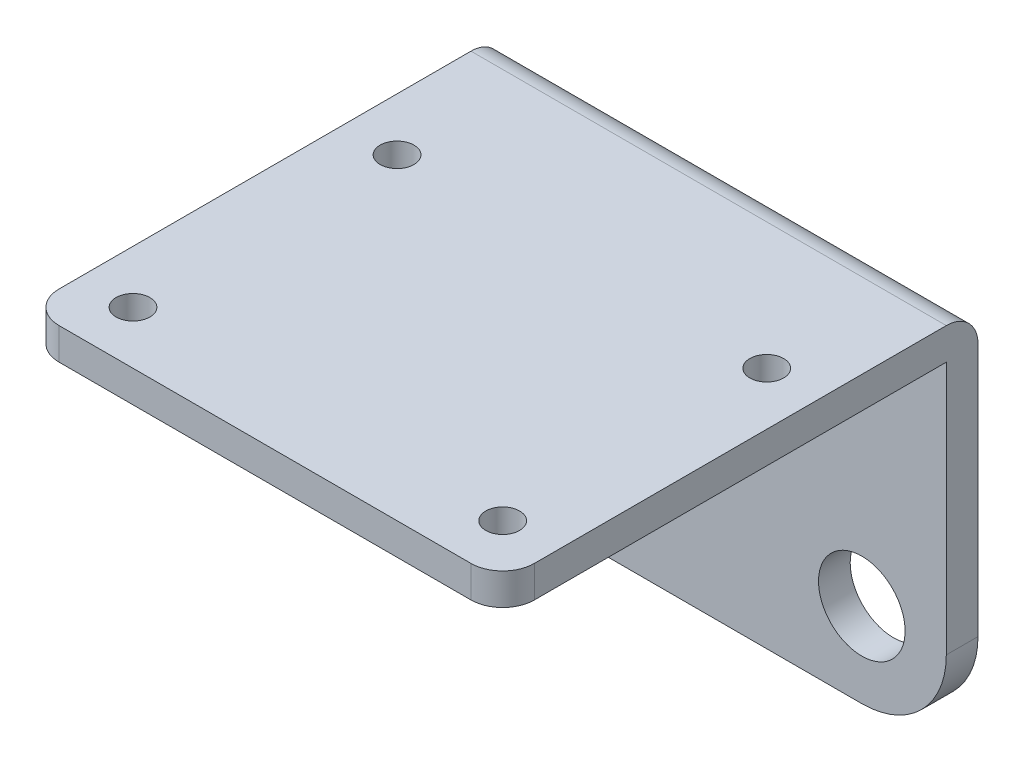
ISO-10303-21;
HEADER;
FILE_DESCRIPTION(('STEP AP214'),'2;1');
FILE_NAME('part.step','',(''),(''),'','','');
FILE_SCHEMA(('AUTOMOTIVE_DESIGN { 1 0 10303 214 1 1 1 1 }'));
ENDSEC;
DATA;
#1=APPLICATION_CONTEXT('core data for automotive mechanical design processes');
#2=APPLICATION_PROTOCOL_DEFINITION('international standard','automotive_design',2000,#1);
#3=PRODUCT_CONTEXT('',#1,'mechanical');
#4=PRODUCT('Part','Part','',(#3));
#5=PRODUCT_RELATED_PRODUCT_CATEGORY('part','',(#4));
#6=PRODUCT_DEFINITION_FORMATION('','',#4);
#7=PRODUCT_DEFINITION_CONTEXT('part definition',#1,'design');
#8=PRODUCT_DEFINITION('design','',#6,#7);
#9=PRODUCT_DEFINITION_SHAPE('','',#8);
#10=(LENGTH_UNIT() NAMED_UNIT(*) SI_UNIT(.MILLI.,.METRE.));
#11=(NAMED_UNIT(*) PLANE_ANGLE_UNIT() SI_UNIT($,.RADIAN.));
#12=(NAMED_UNIT(*) SI_UNIT($,.STERADIAN.) SOLID_ANGLE_UNIT());
#13=UNCERTAINTY_MEASURE_WITH_UNIT(LENGTH_MEASURE(1.E-05),#10,'distance_accuracy_value','');
#14=(GEOMETRIC_REPRESENTATION_CONTEXT(3) GLOBAL_UNCERTAINTY_ASSIGNED_CONTEXT((#13)) GLOBAL_UNIT_ASSIGNED_CONTEXT((#10,
#11,#12)) REPRESENTATION_CONTEXT('',''));
#15=CARTESIAN_POINT('',(0.,0.,0.));
#16=DIRECTION('',(0.,0.,1.));
#17=DIRECTION('',(1.,0.,0.));
#18=AXIS2_PLACEMENT_3D('',#15,#16,#17);
#19=CARTESIAN_POINT('',(0.,0.,0.));
#20=DIRECTION('',(0.,1.,0.));
#21=DIRECTION('',(0.,0.,1.));
#22=AXIS2_PLACEMENT_3D('',#19,#20,#21);
#23=PLANE('',#22);
#24=CARTESIAN_POINT('',(-17.5000000000001,0.,-7.5));
#25=DIRECTION('',(0.,1.,0.));
#26=DIRECTION('',(0.,0.,1.));
#27=AXIS2_PLACEMENT_3D('',#24,#25,#26);
#28=CIRCLE('',#27,1.6);
#29=CARTESIAN_POINT('',(-17.5000000000001,0.,-5.9));
#30=VERTEX_POINT('',#29);
#31=EDGE_CURVE('E152',#30,#30,#28,.T.);
#32=ORIENTED_EDGE('',*,*,#31,.T.);
#33=EDGE_LOOP('',(#32));
#34=FACE_BOUND('',#33,.T.);
#35=CARTESIAN_POINT('',(17.4999999999999,0.,-7.5));
#36=DIRECTION('',(0.,1.,0.));
#37=DIRECTION('',(0.,0.,1.));
#38=AXIS2_PLACEMENT_3D('',#35,#36,#37);
#39=CIRCLE('',#38,1.6);
#40=CARTESIAN_POINT('',(17.4999999999999,0.,-5.9));
#41=VERTEX_POINT('',#40);
#42=EDGE_CURVE('E158',#41,#41,#39,.T.);
#43=ORIENTED_EDGE('',*,*,#42,.T.);
#44=EDGE_LOOP('',(#43));
#45=FACE_BOUND('',#44,.T.);
#46=CARTESIAN_POINT('',(17.5,0.,17.5));
#47=DIRECTION('',(0.,1.,0.));
#48=DIRECTION('',(0.,0.,1.));
#49=AXIS2_PLACEMENT_3D('',#46,#47,#48);
#50=CIRCLE('',#49,1.6);
#51=CARTESIAN_POINT('',(17.5,0.,19.1));
#52=VERTEX_POINT('',#51);
#53=EDGE_CURVE('E163',#52,#52,#50,.T.);
#54=ORIENTED_EDGE('',*,*,#53,.T.);
#55=EDGE_LOOP('',(#54));
#56=FACE_BOUND('',#55,.T.);
#57=CARTESIAN_POINT('',(-17.5,0.,17.5));
#58=DIRECTION('',(0.,1.,0.));
#59=DIRECTION('',(0.,0.,1.));
#60=AXIS2_PLACEMENT_3D('',#57,#58,#59);
#61=CIRCLE('',#60,1.6);
#62=CARTESIAN_POINT('',(-17.5,0.,19.1));
#63=VERTEX_POINT('',#62);
#64=EDGE_CURVE('E168',#63,#63,#61,.T.);
#65=ORIENTED_EDGE('',*,*,#64,.T.);
#66=EDGE_LOOP('',(#65));
#67=FACE_BOUND('',#66,.T.);
#68=DIRECTION('',(0.,0.,-1.));
#69=VECTOR('',#68,1.);
#70=CARTESIAN_POINT('',(22.5,0.,-22.5));
#71=LINE('',#70,#69);
#72=CARTESIAN_POINT('',(22.5,0.,19.5));
#73=VERTEX_POINT('',#72);
#74=CARTESIAN_POINT('',(22.5,0.,-19.5));
#75=VERTEX_POINT('',#74);
#76=EDGE_CURVE('E139',#73,#75,#71,.T.);
#77=ORIENTED_EDGE('',*,*,#76,.F.);
#78=CARTESIAN_POINT('',(19.5,0.,19.5));
#79=DIRECTION('',(0.,1.,0.));
#80=DIRECTION('',(0.,0.,1.));
#81=AXIS2_PLACEMENT_3D('',#78,#79,#80);
#82=CIRCLE('',#81,3.);
#83=CARTESIAN_POINT('',(19.5,0.,22.5));
#84=VERTEX_POINT('',#83);
#85=EDGE_CURVE('E212',#73,#84,#82,.F.);
#86=ORIENTED_EDGE('',*,*,#85,.T.);
#87=DIRECTION('',(1.,0.,0.));
#88=VECTOR('',#87,1.);
#89=CARTESIAN_POINT('',(-22.5,0.,22.5));
#90=LINE('',#89,#88);
#91=CARTESIAN_POINT('',(-19.5,0.,22.5));
#92=VERTEX_POINT('',#91);
#93=EDGE_CURVE('E136',#92,#84,#90,.T.);
#94=ORIENTED_EDGE('',*,*,#93,.F.);
#95=CARTESIAN_POINT('',(-19.5,0.,19.5));
#96=DIRECTION('',(0.,1.,0.));
#97=DIRECTION('',(0.,0.,1.));
#98=AXIS2_PLACEMENT_3D('',#95,#96,#97);
#99=CIRCLE('',#98,3.);
#100=CARTESIAN_POINT('',(-22.5,0.,19.5));
#101=VERTEX_POINT('',#100);
#102=EDGE_CURVE('E140',#92,#101,#99,.F.);
#103=ORIENTED_EDGE('',*,*,#102,.T.);
#104=DIRECTION('',(0.,0.,1.));
#105=VECTOR('',#104,1.);
#106=CARTESIAN_POINT('',(-22.5,0.,-22.5));
#107=LINE('',#106,#105);
#108=CARTESIAN_POINT('',(-22.5,0.,-19.5));
#109=VERTEX_POINT('',#108);
#110=EDGE_CURVE('E122',#109,#101,#107,.T.);
#111=ORIENTED_EDGE('',*,*,#110,.F.);
#112=DIRECTION('',(-1.,0.,0.));
#113=VECTOR('',#112,1.);
#114=CARTESIAN_POINT('',(22.5,0.,-19.5));
#115=LINE('',#114,#113);
#116=EDGE_CURVE('E132',#75,#109,#115,.T.);
#117=ORIENTED_EDGE('',*,*,#116,.F.);
#118=EDGE_LOOP('',(#77,#86,#94,#103,#111,#117));
#119=FACE_BOUND('',#118,.T.);
#120=ADVANCED_FACE('F41',(#34,#45,#56,#67,#119),#23,.F.);
#121=CARTESIAN_POINT('',(0.,3.,0.));
#122=DIRECTION('',(0.,1.,0.));
#123=DIRECTION('',(0.,0.,1.));
#124=AXIS2_PLACEMENT_3D('',#121,#122,#123);
#125=PLANE('',#124);
#126=CARTESIAN_POINT('',(17.4999999999999,3.,-7.5));
#127=DIRECTION('',(0.,1.,0.));
#128=DIRECTION('',(0.,0.,1.));
#129=AXIS2_PLACEMENT_3D('',#126,#127,#128);
#130=CIRCLE('',#129,1.6);
#131=CARTESIAN_POINT('',(17.4999999999999,3.,-5.9));
#132=VERTEX_POINT('',#131);
#133=EDGE_CURVE('E161',#132,#132,#130,.T.);
#134=ORIENTED_EDGE('',*,*,#133,.F.);
#135=EDGE_LOOP('',(#134));
#136=FACE_BOUND('',#135,.T.);
#137=CARTESIAN_POINT('',(-17.5,3.,17.5));
#138=DIRECTION('',(0.,1.,0.));
#139=DIRECTION('',(0.,0.,1.));
#140=AXIS2_PLACEMENT_3D('',#137,#138,#139);
#141=CIRCLE('',#140,1.6);
#142=CARTESIAN_POINT('',(-17.5,3.,19.1));
#143=VERTEX_POINT('',#142);
#144=EDGE_CURVE('E171',#143,#143,#141,.T.);
#145=ORIENTED_EDGE('',*,*,#144,.F.);
#146=EDGE_LOOP('',(#145));
#147=FACE_BOUND('',#146,.T.);
#148=DIRECTION('',(0.,0.,-1.));
#149=VECTOR('',#148,1.);
#150=CARTESIAN_POINT('',(22.5,3.,-22.5));
#151=LINE('',#150,#149);
#152=CARTESIAN_POINT('',(22.5,3.,19.5));
#153=VERTEX_POINT('',#152);
#154=CARTESIAN_POINT('',(22.5,3.,-19.5));
#155=VERTEX_POINT('',#154);
#156=EDGE_CURVE('E176',#153,#155,#151,.T.);
#157=ORIENTED_EDGE('',*,*,#156,.T.);
#158=DIRECTION('',(-1.,0.,0.));
#159=VECTOR('',#158,1.);
#160=CARTESIAN_POINT('',(-22.5,3.,-19.5));
#161=LINE('',#160,#159);
#162=CARTESIAN_POINT('',(-22.5,3.,-19.5));
#163=VERTEX_POINT('',#162);
#164=EDGE_CURVE('E200',#155,#163,#161,.T.);
#165=ORIENTED_EDGE('',*,*,#164,.T.);
#166=DIRECTION('',(0.,0.,1.));
#167=VECTOR('',#166,1.);
#168=CARTESIAN_POINT('',(-22.5,3.,-22.5));
#169=LINE('',#168,#167);
#170=CARTESIAN_POINT('',(-22.5,3.,19.5));
#171=VERTEX_POINT('',#170);
#172=EDGE_CURVE('E182',#163,#171,#169,.T.);
#173=ORIENTED_EDGE('',*,*,#172,.T.);
#174=CARTESIAN_POINT('',(-19.5,3.,19.5));
#175=DIRECTION('',(0.,1.,0.));
#176=DIRECTION('',(0.,0.,1.));
#177=AXIS2_PLACEMENT_3D('',#174,#175,#176);
#178=CIRCLE('',#177,3.);
#179=CARTESIAN_POINT('',(-19.5,3.,22.5));
#180=VERTEX_POINT('',#179);
#181=EDGE_CURVE('E192',#171,#180,#178,.T.);
#182=ORIENTED_EDGE('',*,*,#181,.T.);
#183=DIRECTION('',(1.,0.,0.));
#184=VECTOR('',#183,1.);
#185=CARTESIAN_POINT('',(-22.5,3.,22.5));
#186=LINE('',#185,#184);
#187=CARTESIAN_POINT('',(19.5,3.,22.5));
#188=VERTEX_POINT('',#187);
#189=EDGE_CURVE('E184',#180,#188,#186,.T.);
#190=ORIENTED_EDGE('',*,*,#189,.T.);
#191=CARTESIAN_POINT('',(19.5,3.,19.5));
#192=DIRECTION('',(0.,1.,0.));
#193=DIRECTION('',(0.,0.,1.));
#194=AXIS2_PLACEMENT_3D('',#191,#192,#193);
#195=CIRCLE('',#194,3.);
#196=EDGE_CURVE('E197',#188,#153,#195,.T.);
#197=ORIENTED_EDGE('',*,*,#196,.T.);
#198=EDGE_LOOP('',(#157,#165,#173,#182,#190,#197));
#199=FACE_BOUND('',#198,.T.);
#200=CARTESIAN_POINT('',(17.5,3.,17.5));
#201=DIRECTION('',(0.,1.,0.));
#202=DIRECTION('',(0.,0.,1.));
#203=AXIS2_PLACEMENT_3D('',#200,#201,#202);
#204=CIRCLE('',#203,1.6);
#205=CARTESIAN_POINT('',(17.5,3.,19.1));
#206=VERTEX_POINT('',#205);
#207=EDGE_CURVE('E170',#206,#206,#204,.T.);
#208=ORIENTED_EDGE('',*,*,#207,.F.);
#209=EDGE_LOOP('',(#208));
#210=FACE_BOUND('',#209,.T.);
#211=CARTESIAN_POINT('',(-17.5000000000001,3.,-7.5));
#212=DIRECTION('',(0.,1.,0.));
#213=DIRECTION('',(0.,0.,1.));
#214=AXIS2_PLACEMENT_3D('',#211,#212,#213);
#215=CIRCLE('',#214,1.6);
#216=CARTESIAN_POINT('',(-17.5000000000001,3.,-5.9));
#217=VERTEX_POINT('',#216);
#218=EDGE_CURVE('E154',#217,#217,#215,.T.);
#219=ORIENTED_EDGE('',*,*,#218,.F.);
#220=EDGE_LOOP('',(#219));
#221=FACE_BOUND('',#220,.T.);
#222=ADVANCED_FACE('F247',(#136,#147,#199,#210,#221),#125,.T.);
#223=CARTESIAN_POINT('',(22.5,3.,-22.5));
#224=DIRECTION('',(-1.,0.,0.));
#225=DIRECTION('',(0.,0.,1.));
#226=AXIS2_PLACEMENT_3D('',#223,#224,#225);
#227=PLANE('',#226);
#228=DIRECTION('',(0.,1.,0.));
#229=VECTOR('',#228,1.);
#230=CARTESIAN_POINT('',(22.5,-32.,-19.5));
#231=LINE('',#230,#229);
#232=CARTESIAN_POINT('',(22.5,-24.,-19.5));
#233=VERTEX_POINT('',#232);
#234=EDGE_CURVE('E129',#233,#75,#231,.T.);
#235=ORIENTED_EDGE('',*,*,#234,.F.);
#236=DIRECTION('',(0.,0.,1.));
#237=VECTOR('',#236,1.);
#238=CARTESIAN_POINT('',(22.5,-24.,-22.5));
#239=LINE('',#238,#237);
#240=CARTESIAN_POINT('',(22.5,-24.,-22.5));
#241=VERTEX_POINT('',#240);
#242=EDGE_CURVE('E11',#233,#241,#239,.F.);
#243=ORIENTED_EDGE('',*,*,#242,.T.);
#244=DIRECTION('',(0.,-1.,0.));
#245=VECTOR('',#244,1.);
#246=CARTESIAN_POINT('',(22.5,3.,-22.5));
#247=LINE('',#246,#245);
#248=CARTESIAN_POINT('',(22.5,0.,-22.5));
#249=VERTEX_POINT('',#248);
#250=EDGE_CURVE('E195',#249,#241,#247,.T.);
#251=ORIENTED_EDGE('',*,*,#250,.F.);
#252=CARTESIAN_POINT('',(22.5,0.,-19.5));
#253=DIRECTION('',(-1.,0.,0.));
#254=DIRECTION('',(0.,0.,1.));
#255=AXIS2_PLACEMENT_3D('',#252,#253,#254);
#256=CIRCLE('',#255,3.);
#257=EDGE_CURVE('E211',#249,#155,#256,.F.);
#258=ORIENTED_EDGE('',*,*,#257,.T.);
#259=ORIENTED_EDGE('',*,*,#156,.F.);
#260=DIRECTION('',(0.,-1.,0.));
#261=VECTOR('',#260,1.);
#262=CARTESIAN_POINT('',(22.5,3.,19.5));
#263=LINE('',#262,#261);
#264=EDGE_CURVE('E208',#153,#73,#263,.T.);
#265=ORIENTED_EDGE('',*,*,#264,.T.);
#266=ORIENTED_EDGE('',*,*,#76,.T.);
#267=EDGE_LOOP('',(#235,#243,#251,#258,#259,#265,#266));
#268=FACE_BOUND('',#267,.T.);
#269=ADVANCED_FACE('F260',(#268),#227,.F.);
#270=CARTESIAN_POINT('',(-22.5,3.,-22.5));
#271=DIRECTION('',(0.,0.,1.));
#272=DIRECTION('',(1.,0.,0.));
#273=AXIS2_PLACEMENT_3D('',#270,#271,#272);
#274=PLANE('',#273);
#275=CARTESIAN_POINT('',(14.5,-24.,-22.5));
#276=DIRECTION('',(0.,0.,-1.));
#277=DIRECTION('',(-1.,0.,0.));
#278=AXIS2_PLACEMENT_3D('',#275,#276,#277);
#279=CIRCLE('',#278,4.1);
#280=CARTESIAN_POINT('',(10.4,-24.,-22.5));
#281=VERTEX_POINT('',#280);
#282=EDGE_CURVE('E149',#281,#281,#279,.T.);
#283=ORIENTED_EDGE('',*,*,#282,.F.);
#284=EDGE_LOOP('',(#283));
#285=FACE_BOUND('',#284,.T.);
#286=CARTESIAN_POINT('',(-14.5,-24.,-22.5));
#287=DIRECTION('',(0.,0.,-1.));
#288=DIRECTION('',(-1.,0.,0.));
#289=AXIS2_PLACEMENT_3D('',#286,#287,#288);
#290=CIRCLE('',#289,4.1);
#291=CARTESIAN_POINT('',(-18.6,-24.,-22.5));
#292=VERTEX_POINT('',#291);
#293=EDGE_CURVE('E473',#292,#292,#290,.T.);
#294=ORIENTED_EDGE('',*,*,#293,.F.);
#295=EDGE_LOOP('',(#294));
#296=FACE_BOUND('',#295,.T.);
#297=DIRECTION('',(1.,0.,0.));
#298=VECTOR('',#297,1.);
#299=CARTESIAN_POINT('',(22.5,-32.,-22.5));
#300=LINE('',#299,#298);
#301=CARTESIAN_POINT('',(-14.5,-32.,-22.5));
#302=VERTEX_POINT('',#301);
#303=CARTESIAN_POINT('',(14.5,-32.,-22.5));
#304=VERTEX_POINT('',#303);
#305=EDGE_CURVE('E128',#302,#304,#300,.T.);
#306=ORIENTED_EDGE('',*,*,#305,.F.);
#307=CARTESIAN_POINT('',(-14.5,-24.,-22.5));
#308=DIRECTION('',(0.,0.,1.));
#309=DIRECTION('',(1.,0.,0.));
#310=AXIS2_PLACEMENT_3D('',#307,#308,#309);
#311=CIRCLE('',#310,8.);
#312=CARTESIAN_POINT('',(-22.5,-24.,-22.5));
#313=VERTEX_POINT('',#312);
#314=EDGE_CURVE('E229',#302,#313,#311,.F.);
#315=ORIENTED_EDGE('',*,*,#314,.T.);
#316=DIRECTION('',(0.,-1.,0.));
#317=VECTOR('',#316,1.);
#318=CARTESIAN_POINT('',(-22.5,3.,-22.5));
#319=LINE('',#318,#317);
#320=CARTESIAN_POINT('',(-22.5,0.,-22.5));
#321=VERTEX_POINT('',#320);
#322=EDGE_CURVE('E190',#321,#313,#319,.T.);
#323=ORIENTED_EDGE('',*,*,#322,.F.);
#324=DIRECTION('',(-1.,0.,0.));
#325=VECTOR('',#324,1.);
#326=CARTESIAN_POINT('',(22.5,0.,-22.5));
#327=LINE('',#326,#325);
#328=EDGE_CURVE('E206',#321,#249,#327,.F.);
#329=ORIENTED_EDGE('',*,*,#328,.T.);
#330=ORIENTED_EDGE('',*,*,#250,.T.);
#331=CARTESIAN_POINT('',(14.5,-24.,-22.5));
#332=DIRECTION('',(0.,0.,1.));
#333=DIRECTION('',(1.,0.,0.));
#334=AXIS2_PLACEMENT_3D('',#331,#332,#333);
#335=CIRCLE('',#334,8.);
#336=EDGE_CURVE('E230',#241,#304,#335,.F.);
#337=ORIENTED_EDGE('',*,*,#336,.T.);
#338=EDGE_LOOP('',(#306,#315,#323,#329,#330,#337));
#339=FACE_BOUND('',#338,.T.);
#340=ADVANCED_FACE('F245',(#285,#296,#339),#274,.F.);
#341=CARTESIAN_POINT('',(-22.5,3.,-22.5));
#342=DIRECTION('',(1.,0.,0.));
#343=DIRECTION('',(0.,0.,-1.));
#344=AXIS2_PLACEMENT_3D('',#341,#342,#343);
#345=PLANE('',#344);
#346=ORIENTED_EDGE('',*,*,#322,.T.);
#347=DIRECTION('',(0.,0.,-1.));
#348=VECTOR('',#347,1.);
#349=CARTESIAN_POINT('',(-22.5,-24.,-19.5));
#350=LINE('',#349,#348);
#351=CARTESIAN_POINT('',(-22.5,-24.,-19.5));
#352=VERTEX_POINT('',#351);
#353=EDGE_CURVE('E64',#313,#352,#350,.F.);
#354=ORIENTED_EDGE('',*,*,#353,.T.);
#355=DIRECTION('',(0.,1.,0.));
#356=VECTOR('',#355,1.);
#357=CARTESIAN_POINT('',(-22.5,-32.,-19.5));
#358=LINE('',#357,#356);
#359=EDGE_CURVE('E125',#352,#109,#358,.T.);
#360=ORIENTED_EDGE('',*,*,#359,.T.);
#361=ORIENTED_EDGE('',*,*,#110,.T.);
#362=DIRECTION('',(0.,-1.,0.));
#363=VECTOR('',#362,1.);
#364=CARTESIAN_POINT('',(-22.5,3.,19.5));
#365=LINE('',#364,#363);
#366=EDGE_CURVE('E205',#101,#171,#365,.F.);
#367=ORIENTED_EDGE('',*,*,#366,.T.);
#368=ORIENTED_EDGE('',*,*,#172,.F.);
#369=CARTESIAN_POINT('',(-22.5,0.,-19.5));
#370=DIRECTION('',(1.,0.,0.));
#371=DIRECTION('',(0.,0.,-1.));
#372=AXIS2_PLACEMENT_3D('',#369,#370,#371);
#373=CIRCLE('',#372,3.);
#374=EDGE_CURVE('E204',#163,#321,#373,.F.);
#375=ORIENTED_EDGE('',*,*,#374,.T.);
#376=EDGE_LOOP('',(#346,#354,#360,#361,#367,#368,#375));
#377=FACE_BOUND('',#376,.T.);
#378=ADVANCED_FACE('F124',(#377),#345,.F.);
#379=CARTESIAN_POINT('',(-22.5,3.,22.5));
#380=DIRECTION('',(0.,0.,-1.));
#381=DIRECTION('',(-1.,0.,0.));
#382=AXIS2_PLACEMENT_3D('',#379,#380,#381);
#383=PLANE('',#382);
#384=ORIENTED_EDGE('',*,*,#93,.T.);
#385=DIRECTION('',(0.,-1.,0.));
#386=VECTOR('',#385,1.);
#387=CARTESIAN_POINT('',(19.5,3.,22.5));
#388=LINE('',#387,#386);
#389=EDGE_CURVE('E218',#84,#188,#388,.F.);
#390=ORIENTED_EDGE('',*,*,#389,.T.);
#391=ORIENTED_EDGE('',*,*,#189,.F.);
#392=DIRECTION('',(0.,-1.,0.));
#393=VECTOR('',#392,1.);
#394=CARTESIAN_POINT('',(-19.5,3.,22.5));
#395=LINE('',#394,#393);
#396=EDGE_CURVE('E216',#180,#92,#395,.T.);
#397=ORIENTED_EDGE('',*,*,#396,.T.);
#398=EDGE_LOOP('',(#384,#390,#391,#397));
#399=FACE_BOUND('',#398,.T.);
#400=ADVANCED_FACE('F263',(#399),#383,.F.);
#401=CARTESIAN_POINT('',(-17.5,3.,17.5));
#402=DIRECTION('',(0.,-1.,0.));
#403=DIRECTION('',(0.,0.,-1.));
#404=AXIS2_PLACEMENT_3D('',#401,#402,#403);
#405=CYLINDRICAL_SURFACE('',#404,1.6);
#406=ORIENTED_EDGE('',*,*,#144,.T.);
#407=EDGE_LOOP('',(#406));
#408=FACE_BOUND('',#407,.T.);
#409=ORIENTED_EDGE('',*,*,#64,.F.);
#410=EDGE_LOOP('',(#409));
#411=FACE_BOUND('',#410,.T.);
#412=ADVANCED_FACE('F287',(#408,#411),#405,.F.);
#413=CARTESIAN_POINT('',(17.5,3.,17.5));
#414=DIRECTION('',(0.,-1.,0.));
#415=DIRECTION('',(0.,0.,-1.));
#416=AXIS2_PLACEMENT_3D('',#413,#414,#415);
#417=CYLINDRICAL_SURFACE('',#416,1.6);
#418=ORIENTED_EDGE('',*,*,#207,.T.);
#419=EDGE_LOOP('',(#418));
#420=FACE_BOUND('',#419,.T.);
#421=ORIENTED_EDGE('',*,*,#53,.F.);
#422=EDGE_LOOP('',(#421));
#423=FACE_BOUND('',#422,.T.);
#424=ADVANCED_FACE('F322',(#420,#423),#417,.F.);
#425=CARTESIAN_POINT('',(17.4999999999999,3.,-7.5));
#426=DIRECTION('',(0.,-1.,0.));
#427=DIRECTION('',(0.,0.,-1.));
#428=AXIS2_PLACEMENT_3D('',#425,#426,#427);
#429=CYLINDRICAL_SURFACE('',#428,1.6);
#430=ORIENTED_EDGE('',*,*,#133,.T.);
#431=EDGE_LOOP('',(#430));
#432=FACE_BOUND('',#431,.T.);
#433=ORIENTED_EDGE('',*,*,#42,.F.);
#434=EDGE_LOOP('',(#433));
#435=FACE_BOUND('',#434,.T.);
#436=ADVANCED_FACE('F319',(#432,#435),#429,.F.);
#437=CARTESIAN_POINT('',(-17.5000000000001,3.,-7.5));
#438=DIRECTION('',(0.,-1.,0.));
#439=DIRECTION('',(0.,0.,-1.));
#440=AXIS2_PLACEMENT_3D('',#437,#438,#439);
#441=CYLINDRICAL_SURFACE('',#440,1.6);
#442=ORIENTED_EDGE('',*,*,#218,.T.);
#443=EDGE_LOOP('',(#442));
#444=FACE_BOUND('',#443,.T.);
#445=ORIENTED_EDGE('',*,*,#31,.F.);
#446=EDGE_LOOP('',(#445));
#447=FACE_BOUND('',#446,.T.);
#448=ADVANCED_FACE('F316',(#444,#447),#441,.F.);
#449=CARTESIAN_POINT('',(22.5,-32.,-19.5));
#450=DIRECTION('',(0.,0.,-1.));
#451=DIRECTION('',(-1.,0.,0.));
#452=AXIS2_PLACEMENT_3D('',#449,#450,#451);
#453=PLANE('',#452);
#454=CARTESIAN_POINT('',(14.5,-24.,-19.5));
#455=DIRECTION('',(0.,0.,-1.));
#456=DIRECTION('',(-1.,0.,0.));
#457=AXIS2_PLACEMENT_3D('',#454,#455,#456);
#458=CIRCLE('',#457,4.1);
#459=CARTESIAN_POINT('',(10.4,-24.,-19.5));
#460=VERTEX_POINT('',#459);
#461=EDGE_CURVE('E145',#460,#460,#458,.F.);
#462=ORIENTED_EDGE('',*,*,#461,.F.);
#463=EDGE_LOOP('',(#462));
#464=FACE_BOUND('',#463,.T.);
#465=CARTESIAN_POINT('',(-14.5,-24.,-19.5));
#466=DIRECTION('',(0.,0.,-1.));
#467=DIRECTION('',(-1.,0.,0.));
#468=AXIS2_PLACEMENT_3D('',#465,#466,#467);
#469=CIRCLE('',#468,4.1);
#470=CARTESIAN_POINT('',(-18.6,-24.,-19.5));
#471=VERTEX_POINT('',#470);
#472=EDGE_CURVE('E469',#471,#471,#469,.F.);
#473=ORIENTED_EDGE('',*,*,#472,.F.);
#474=EDGE_LOOP('',(#473));
#475=FACE_BOUND('',#474,.T.);
#476=ORIENTED_EDGE('',*,*,#359,.F.);
#477=CARTESIAN_POINT('',(-14.5,-24.,-19.5));
#478=DIRECTION('',(0.,0.,-1.));
#479=DIRECTION('',(-1.,0.,0.));
#480=AXIS2_PLACEMENT_3D('',#477,#478,#479);
#481=CIRCLE('',#480,8.);
#482=CARTESIAN_POINT('',(-14.5,-32.,-19.5));
#483=VERTEX_POINT('',#482);
#484=EDGE_CURVE('E47',#352,#483,#481,.F.);
#485=ORIENTED_EDGE('',*,*,#484,.T.);
#486=DIRECTION('',(-1.,0.,0.));
#487=VECTOR('',#486,1.);
#488=CARTESIAN_POINT('',(22.5,-32.,-19.5));
#489=LINE('',#488,#487);
#490=CARTESIAN_POINT('',(14.5,-32.,-19.5));
#491=VERTEX_POINT('',#490);
#492=EDGE_CURVE('E141',#491,#483,#489,.T.);
#493=ORIENTED_EDGE('',*,*,#492,.F.);
#494=CARTESIAN_POINT('',(14.5,-24.,-19.5));
#495=DIRECTION('',(0.,0.,-1.));
#496=DIRECTION('',(-1.,0.,0.));
#497=AXIS2_PLACEMENT_3D('',#494,#495,#496);
#498=CIRCLE('',#497,8.);
#499=EDGE_CURVE('E57',#491,#233,#498,.F.);
#500=ORIENTED_EDGE('',*,*,#499,.T.);
#501=ORIENTED_EDGE('',*,*,#234,.T.);
#502=ORIENTED_EDGE('',*,*,#116,.T.);
#503=EDGE_LOOP('',(#476,#485,#493,#500,#501,#502));
#504=FACE_BOUND('',#503,.T.);
#505=ADVANCED_FACE('F143',(#464,#475,#504),#453,.F.);
#506=CARTESIAN_POINT('',(0.,-32.,0.));
#507=DIRECTION('',(0.,-1.,0.));
#508=DIRECTION('',(0.,0.,-1.));
#509=AXIS2_PLACEMENT_3D('',#506,#507,#508);
#510=PLANE('',#509);
#511=ORIENTED_EDGE('',*,*,#492,.T.);
#512=DIRECTION('',(0.,0.,-1.));
#513=VECTOR('',#512,1.);
#514=CARTESIAN_POINT('',(-14.5,-32.,-22.5));
#515=LINE('',#514,#513);
#516=EDGE_CURVE('E221',#483,#302,#515,.T.);
#517=ORIENTED_EDGE('',*,*,#516,.T.);
#518=ORIENTED_EDGE('',*,*,#305,.T.);
#519=DIRECTION('',(0.,0.,1.));
#520=VECTOR('',#519,1.);
#521=CARTESIAN_POINT('',(14.5,-32.,-19.5));
#522=LINE('',#521,#520);
#523=EDGE_CURVE('E222',#304,#491,#522,.T.);
#524=ORIENTED_EDGE('',*,*,#523,.T.);
#525=EDGE_LOOP('',(#511,#517,#518,#524));
#526=FACE_BOUND('',#525,.T.);
#527=ADVANCED_FACE('F232',(#526),#510,.T.);
#528=CARTESIAN_POINT('',(-14.5,-24.,22.501));
#529=DIRECTION('',(0.,0.,-1.));
#530=DIRECTION('',(-1.,0.,0.));
#531=AXIS2_PLACEMENT_3D('',#528,#529,#530);
#532=CYLINDRICAL_SURFACE('',#531,4.1);
#533=ORIENTED_EDGE('',*,*,#293,.T.);
#534=EDGE_LOOP('',(#533));
#535=FACE_BOUND('',#534,.T.);
#536=ORIENTED_EDGE('',*,*,#472,.T.);
#537=EDGE_LOOP('',(#536));
#538=FACE_BOUND('',#537,.T.);
#539=ADVANCED_FACE('F303',(#535,#538),#532,.F.);
#540=CARTESIAN_POINT('',(14.5,-24.,22.501));
#541=DIRECTION('',(0.,0.,-1.));
#542=DIRECTION('',(-1.,0.,0.));
#543=AXIS2_PLACEMENT_3D('',#540,#541,#542);
#544=CYLINDRICAL_SURFACE('',#543,4.1);
#545=ORIENTED_EDGE('',*,*,#282,.T.);
#546=EDGE_LOOP('',(#545));
#547=FACE_BOUND('',#546,.T.);
#548=ORIENTED_EDGE('',*,*,#461,.T.);
#549=EDGE_LOOP('',(#548));
#550=FACE_BOUND('',#549,.T.);
#551=ADVANCED_FACE('F296',(#547,#550),#544,.F.);
#552=CARTESIAN_POINT('',(0.,0.,-19.5));
#553=DIRECTION('',(1.,0.,0.));
#554=DIRECTION('',(0.,0.,-1.));
#555=AXIS2_PLACEMENT_3D('',#552,#553,#554);
#556=CYLINDRICAL_SURFACE('',#555,3.);
#557=ORIENTED_EDGE('',*,*,#257,.F.);
#558=ORIENTED_EDGE('',*,*,#328,.F.);
#559=ORIENTED_EDGE('',*,*,#374,.F.);
#560=ORIENTED_EDGE('',*,*,#164,.F.);
#561=EDGE_LOOP('',(#557,#558,#559,#560));
#562=FACE_BOUND('',#561,.T.);
#563=ADVANCED_FACE('F246',(#562),#556,.T.);
#564=CARTESIAN_POINT('',(19.5,3.,19.5));
#565=DIRECTION('',(0.,-1.,0.));
#566=DIRECTION('',(0.,0.,-1.));
#567=AXIS2_PLACEMENT_3D('',#564,#565,#566);
#568=CYLINDRICAL_SURFACE('',#567,3.);
#569=ORIENTED_EDGE('',*,*,#196,.F.);
#570=ORIENTED_EDGE('',*,*,#389,.F.);
#571=ORIENTED_EDGE('',*,*,#85,.F.);
#572=ORIENTED_EDGE('',*,*,#264,.F.);
#573=EDGE_LOOP('',(#569,#570,#571,#572));
#574=FACE_BOUND('',#573,.T.);
#575=ADVANCED_FACE('F257',(#574),#568,.T.);
#576=CARTESIAN_POINT('',(-19.5,3.,19.5));
#577=DIRECTION('',(0.,-1.,0.));
#578=DIRECTION('',(0.,0.,-1.));
#579=AXIS2_PLACEMENT_3D('',#576,#577,#578);
#580=CYLINDRICAL_SURFACE('',#579,3.);
#581=ORIENTED_EDGE('',*,*,#181,.F.);
#582=ORIENTED_EDGE('',*,*,#366,.F.);
#583=ORIENTED_EDGE('',*,*,#102,.F.);
#584=ORIENTED_EDGE('',*,*,#396,.F.);
#585=EDGE_LOOP('',(#581,#582,#583,#584));
#586=FACE_BOUND('',#585,.T.);
#587=ADVANCED_FACE('F270',(#586),#580,.T.);
#588=CARTESIAN_POINT('',(-14.5,-24.,0.));
#589=DIRECTION('',(0.,0.,1.));
#590=DIRECTION('',(1.,0.,0.));
#591=AXIS2_PLACEMENT_3D('',#588,#589,#590);
#592=CYLINDRICAL_SURFACE('',#591,8.);
#593=ORIENTED_EDGE('',*,*,#484,.F.);
#594=ORIENTED_EDGE('',*,*,#353,.F.);
#595=ORIENTED_EDGE('',*,*,#314,.F.);
#596=ORIENTED_EDGE('',*,*,#516,.F.);
#597=EDGE_LOOP('',(#593,#594,#595,#596));
#598=FACE_BOUND('',#597,.T.);
#599=ADVANCED_FACE('F239',(#598),#592,.T.);
#600=CARTESIAN_POINT('',(14.5,-24.,0.));
#601=DIRECTION('',(0.,0.,-1.));
#602=DIRECTION('',(-1.,0.,0.));
#603=AXIS2_PLACEMENT_3D('',#600,#601,#602);
#604=CYLINDRICAL_SURFACE('',#603,8.);
#605=ORIENTED_EDGE('',*,*,#336,.F.);
#606=ORIENTED_EDGE('',*,*,#242,.F.);
#607=ORIENTED_EDGE('',*,*,#499,.F.);
#608=ORIENTED_EDGE('',*,*,#523,.F.);
#609=EDGE_LOOP('',(#605,#606,#607,#608));
#610=FACE_BOUND('',#609,.T.);
#611=ADVANCED_FACE('F43',(#610),#604,.T.);
#612=CLOSED_SHELL('',(#120,#222,#269,#340,#378,#400,#412,#424,#436,#448,#505,#527,#539,#551,
#563,#575,#587,#599,#611));
#613=MANIFOLD_SOLID_BREP('B2',#612);
#614=ADVANCED_BREP_SHAPE_REPRESENTATION('',(#18,#613),#14);
#615=SHAPE_DEFINITION_REPRESENTATION(#9,#614);
ENDSEC;
END-ISO-10303-21;
